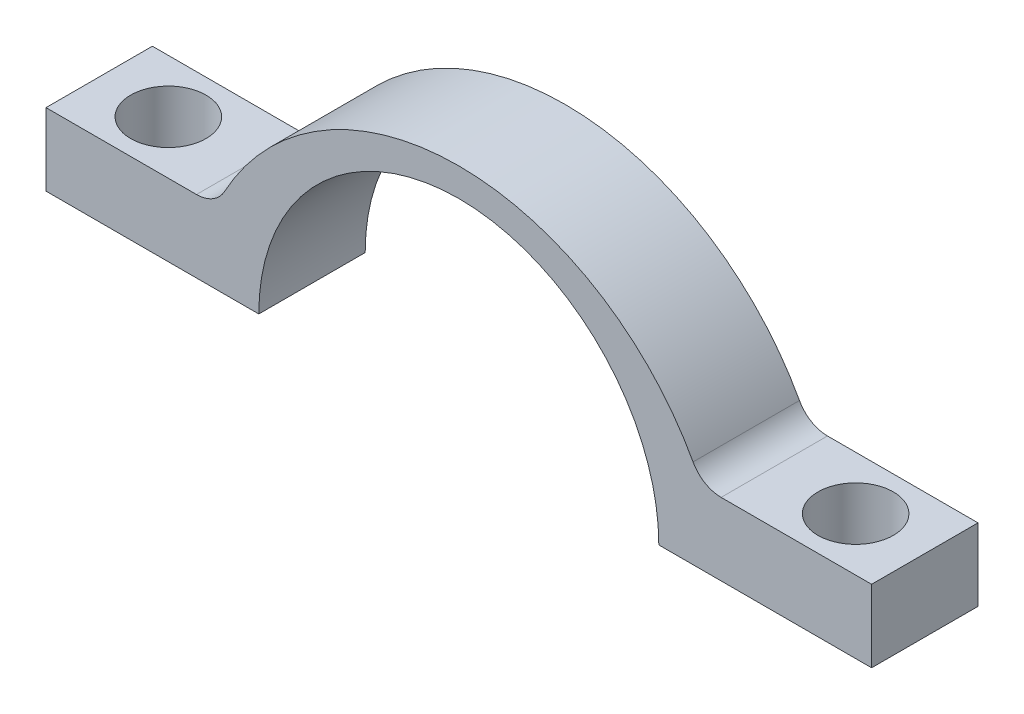
ISO-10303-21;
HEADER;
FILE_DESCRIPTION(('STEP AP214'),'2;1');
FILE_NAME('part.step','',(''),(''),'','','');
FILE_SCHEMA(('AUTOMOTIVE_DESIGN { 1 0 10303 214 1 1 1 1 }'));
ENDSEC;
DATA;
#1=APPLICATION_CONTEXT('core data for automotive mechanical design processes');
#2=APPLICATION_PROTOCOL_DEFINITION('international standard','automotive_design',2000,#1);
#3=PRODUCT_CONTEXT('',#1,'mechanical');
#4=PRODUCT('Part','Part','',(#3));
#5=PRODUCT_RELATED_PRODUCT_CATEGORY('part','',(#4));
#6=PRODUCT_DEFINITION_FORMATION('','',#4);
#7=PRODUCT_DEFINITION_CONTEXT('part definition',#1,'design');
#8=PRODUCT_DEFINITION('design','',#6,#7);
#9=PRODUCT_DEFINITION_SHAPE('','',#8);
#10=(LENGTH_UNIT() NAMED_UNIT(*) SI_UNIT(.MILLI.,.METRE.));
#11=(NAMED_UNIT(*) PLANE_ANGLE_UNIT() SI_UNIT($,.RADIAN.));
#12=(NAMED_UNIT(*) SI_UNIT($,.STERADIAN.) SOLID_ANGLE_UNIT());
#13=UNCERTAINTY_MEASURE_WITH_UNIT(LENGTH_MEASURE(1.E-05),#10,'distance_accuracy_value','');
#14=(GEOMETRIC_REPRESENTATION_CONTEXT(3) GLOBAL_UNCERTAINTY_ASSIGNED_CONTEXT((#13)) GLOBAL_UNIT_ASSIGNED_CONTEXT((#10,
#11,#12)) REPRESENTATION_CONTEXT('',''));
#15=CARTESIAN_POINT('',(0.,0.,0.));
#16=DIRECTION('',(0.,0.,1.));
#17=DIRECTION('',(1.,0.,0.));
#18=AXIS2_PLACEMENT_3D('',#15,#16,#17);
#19=CARTESIAN_POINT('',(-24.638,0.,6.35));
#20=DIRECTION('',(0.,0.,-1.));
#21=DIRECTION('',(-1.,0.,0.));
#22=AXIS2_PLACEMENT_3D('',#19,#20,#21);
#23=CYLINDRICAL_SURFACE('',#22,11.938);
#24=DIRECTION('',(0.,0.,-1.));
#25=VECTOR('',#24,1.);
#26=CARTESIAN_POINT('',(-24.638,11.938,6.35));
#27=LINE('',#26,#25);
#28=CARTESIAN_POINT('',(-24.638,11.938,0.));
#29=VERTEX_POINT('',#28);
#30=CARTESIAN_POINT('',(-24.638,11.938,6.35));
#31=VERTEX_POINT('',#30);
#32=EDGE_CURVE('E11',#29,#31,#27,.F.);
#33=ORIENTED_EDGE('',*,*,#32,.F.);
#34=CARTESIAN_POINT('',(-24.638,0.,0.));
#35=DIRECTION('',(0.,0.,-1.));
#36=DIRECTION('',(-1.,0.,0.));
#37=AXIS2_PLACEMENT_3D('',#34,#35,#36);
#38=CIRCLE('',#37,11.938);
#39=CARTESIAN_POINT('',(-12.7,0.,0.));
#40=VERTEX_POINT('',#39);
#41=EDGE_CURVE('E197',#29,#40,#38,.T.);
#42=ORIENTED_EDGE('',*,*,#41,.T.);
#43=DIRECTION('',(0.,0.,-1.));
#44=VECTOR('',#43,1.);
#45=CARTESIAN_POINT('',(-12.7,0.,6.35));
#46=LINE('',#45,#44);
#47=CARTESIAN_POINT('',(-12.7,0.,6.35));
#48=VERTEX_POINT('',#47);
#49=EDGE_CURVE('E203',#48,#40,#46,.T.);
#50=ORIENTED_EDGE('',*,*,#49,.F.);
#51=CARTESIAN_POINT('',(-24.638,0.,6.35));
#52=DIRECTION('',(0.,0.,-1.));
#53=DIRECTION('',(-1.,0.,0.));
#54=AXIS2_PLACEMENT_3D('',#51,#52,#53);
#55=CIRCLE('',#54,11.938);
#56=EDGE_CURVE('E225',#31,#48,#55,.T.);
#57=ORIENTED_EDGE('',*,*,#56,.F.);
#58=EDGE_LOOP('',(#33,#42,#50,#57));
#59=FACE_BOUND('',#58,.T.);
#60=ADVANCED_FACE('F41',(#59),#23,.F.);
#61=CARTESIAN_POINT('',(0.,0.,6.35));
#62=DIRECTION('',(-1.,0.,0.));
#63=DIRECTION('',(0.,0.,1.));
#64=AXIS2_PLACEMENT_3D('',#61,#62,#63);
#65=PLANE('',#64);
#66=DIRECTION('',(0.,1.,0.));
#67=VECTOR('',#66,1.);
#68=CARTESIAN_POINT('',(0.,0.,0.));
#69=LINE('',#68,#67);
#70=CARTESIAN_POINT('',(0.,0.,0.));
#71=VERTEX_POINT('',#70);
#72=CARTESIAN_POINT('',(0.,4.318,0.));
#73=VERTEX_POINT('',#72);
#74=EDGE_CURVE('E147',#71,#73,#69,.T.);
#75=ORIENTED_EDGE('',*,*,#74,.T.);
#76=DIRECTION('',(0.,0.,-1.));
#77=VECTOR('',#76,1.);
#78=CARTESIAN_POINT('',(0.,4.318,6.35));
#79=LINE('',#78,#77);
#80=CARTESIAN_POINT('',(0.,4.318,6.35));
#81=VERTEX_POINT('',#80);
#82=EDGE_CURVE('E127',#81,#73,#79,.T.);
#83=ORIENTED_EDGE('',*,*,#82,.F.);
#84=DIRECTION('',(0.,1.,0.));
#85=VECTOR('',#84,1.);
#86=CARTESIAN_POINT('',(0.,0.,6.35));
#87=LINE('',#86,#85);
#88=CARTESIAN_POINT('',(0.,0.,6.35));
#89=VERTEX_POINT('',#88);
#90=EDGE_CURVE('E134',#89,#81,#87,.T.);
#91=ORIENTED_EDGE('',*,*,#90,.F.);
#92=DIRECTION('',(0.,0.,-1.));
#93=VECTOR('',#92,1.);
#94=CARTESIAN_POINT('',(0.,0.,6.35));
#95=LINE('',#94,#93);
#96=EDGE_CURVE('E201',#89,#71,#95,.T.);
#97=ORIENTED_EDGE('',*,*,#96,.T.);
#98=EDGE_LOOP('',(#75,#83,#91,#97));
#99=FACE_BOUND('',#98,.T.);
#100=ADVANCED_FACE('F145',(#99),#65,.F.);
#101=CARTESIAN_POINT('',(0.,4.318,6.35));
#102=DIRECTION('',(0.,-1.,0.));
#103=DIRECTION('',(1.,0.,0.));
#104=AXIS2_PLACEMENT_3D('',#101,#102,#103);
#105=PLANE('',#104);
#106=CARTESIAN_POINT('',(-4.12749999999995,4.318,3.17499999999999));
#107=DIRECTION('',(0.,1.,0.));
#108=DIRECTION('',(0.,0.,1.));
#109=AXIS2_PLACEMENT_3D('',#106,#107,#108);
#110=CIRCLE('',#109,2.25);
#111=CARTESIAN_POINT('',(-4.12749999999995,4.318,5.42499999999999));
#112=VERTEX_POINT('',#111);
#113=EDGE_CURVE('E234',#112,#112,#110,.T.);
#114=ORIENTED_EDGE('',*,*,#113,.F.);
#115=EDGE_LOOP('',(#114));
#116=FACE_BOUND('',#115,.T.);
#117=DIRECTION('',(-1.,0.,0.));
#118=VECTOR('',#117,1.);
#119=CARTESIAN_POINT('',(0.,4.318,0.));
#120=LINE('',#119,#118);
#121=CARTESIAN_POINT('',(-8.98296945951191,4.318,0.));
#122=VERTEX_POINT('',#121);
#123=EDGE_CURVE('E183',#73,#122,#120,.T.);
#124=ORIENTED_EDGE('',*,*,#123,.T.);
#125=DIRECTION('',(0.,0.,1.));
#126=VECTOR('',#125,1.);
#127=CARTESIAN_POINT('',(-8.98296945951191,4.318,6.35));
#128=LINE('',#127,#126);
#129=CARTESIAN_POINT('',(-8.98296945951191,4.318,6.35));
#130=VERTEX_POINT('',#129);
#131=EDGE_CURVE('E130',#122,#130,#128,.T.);
#132=ORIENTED_EDGE('',*,*,#131,.T.);
#133=DIRECTION('',(-1.,0.,0.));
#134=VECTOR('',#133,1.);
#135=CARTESIAN_POINT('',(0.,4.318,6.35));
#136=LINE('',#135,#134);
#137=EDGE_CURVE('E122',#81,#130,#136,.T.);
#138=ORIENTED_EDGE('',*,*,#137,.F.);
#139=ORIENTED_EDGE('',*,*,#82,.T.);
#140=EDGE_LOOP('',(#124,#132,#138,#139));
#141=FACE_BOUND('',#140,.T.);
#142=ADVANCED_FACE('F125',(#116,#141),#105,.F.);
#143=CARTESIAN_POINT('',(-24.638,-2.286,6.35));
#144=DIRECTION('',(0.,0.,-1.));
#145=DIRECTION('',(-1.,0.,0.));
#146=AXIS2_PLACEMENT_3D('',#143,#144,#145);
#147=CYLINDRICAL_SURFACE('',#146,15.9130543893999);
#148=CARTESIAN_POINT('',(-24.638,-2.286,0.));
#149=DIRECTION('',(0.,0.,1.));
#150=DIRECTION('',(-1.,0.,0.));
#151=AXIS2_PLACEMENT_3D('',#148,#149,#150);
#152=CIRCLE('',#151,15.9130543893999);
#153=CARTESIAN_POINT('',(-10.6567118630244,5.31326851946062,0.));
#154=VERTEX_POINT('',#153);
#155=CARTESIAN_POINT('',(-38.6192881369756,5.31326851946061,0.));
#156=VERTEX_POINT('',#155);
#157=EDGE_CURVE('E184',#154,#156,#152,.T.);
#158=ORIENTED_EDGE('',*,*,#157,.T.);
#159=DIRECTION('',(0.,0.,-1.));
#160=VECTOR('',#159,1.);
#161=CARTESIAN_POINT('',(-38.6192881369756,5.31326851946062,6.35));
#162=LINE('',#161,#160);
#163=CARTESIAN_POINT('',(-38.6192881369756,5.31326851946061,6.35));
#164=VERTEX_POINT('',#163);
#165=EDGE_CURVE('E161',#156,#164,#162,.F.);
#166=ORIENTED_EDGE('',*,*,#165,.T.);
#167=CARTESIAN_POINT('',(-24.638,-2.286,6.35));
#168=DIRECTION('',(0.,0.,1.));
#169=DIRECTION('',(-1.,0.,0.));
#170=AXIS2_PLACEMENT_3D('',#167,#168,#169);
#171=CIRCLE('',#170,15.9130543893999);
#172=CARTESIAN_POINT('',(-10.6567118630244,5.31326851946062,6.35));
#173=VERTEX_POINT('',#172);
#174=EDGE_CURVE('E133',#173,#164,#171,.T.);
#175=ORIENTED_EDGE('',*,*,#174,.F.);
#176=DIRECTION('',(0.,0.,-1.));
#177=VECTOR('',#176,1.);
#178=CARTESIAN_POINT('',(-10.6567118630244,5.31326851946062,6.35));
#179=LINE('',#178,#177);
#180=EDGE_CURVE('E152',#173,#154,#179,.T.);
#181=ORIENTED_EDGE('',*,*,#180,.T.);
#182=EDGE_LOOP('',(#158,#166,#175,#181));
#183=FACE_BOUND('',#182,.T.);
#184=ADVANCED_FACE('F176',(#183),#147,.T.);
#185=CARTESIAN_POINT('',(-49.276,4.31799999999999,6.35));
#186=DIRECTION('',(0.,-1.,0.));
#187=DIRECTION('',(0.,0.,-1.));
#188=AXIS2_PLACEMENT_3D('',#185,#186,#187);
#189=PLANE('',#188);
#190=CARTESIAN_POINT('',(-45.1485,4.318,3.17499999999999));
#191=DIRECTION('',(0.,1.,0.));
#192=DIRECTION('',(0.,0.,1.));
#193=AXIS2_PLACEMENT_3D('',#190,#191,#192);
#194=CIRCLE('',#193,2.25);
#195=CARTESIAN_POINT('',(-45.1485,4.318,5.425));
#196=VERTEX_POINT('',#195);
#197=EDGE_CURVE('E240',#196,#196,#194,.T.);
#198=ORIENTED_EDGE('',*,*,#197,.F.);
#199=EDGE_LOOP('',(#198));
#200=FACE_BOUND('',#199,.T.);
#201=DIRECTION('',(-1.,0.,0.));
#202=VECTOR('',#201,1.);
#203=CARTESIAN_POINT('',(-49.276,4.31799999999999,6.35));
#204=LINE('',#203,#202);
#205=CARTESIAN_POINT('',(-40.293030540488,4.31799999999999,6.35));
#206=VERTEX_POINT('',#205);
#207=CARTESIAN_POINT('',(-49.276,4.31799999999999,6.35));
#208=VERTEX_POINT('',#207);
#209=EDGE_CURVE('E179',#206,#208,#204,.T.);
#210=ORIENTED_EDGE('',*,*,#209,.F.);
#211=DIRECTION('',(0.,0.,1.));
#212=VECTOR('',#211,1.);
#213=CARTESIAN_POINT('',(-40.293030540488,4.31799999999999,0.));
#214=LINE('',#213,#212);
#215=CARTESIAN_POINT('',(-40.293030540488,4.31799999999999,0.));
#216=VERTEX_POINT('',#215);
#217=EDGE_CURVE('E148',#206,#216,#214,.F.);
#218=ORIENTED_EDGE('',*,*,#217,.T.);
#219=DIRECTION('',(-1.,0.,0.));
#220=VECTOR('',#219,1.);
#221=CARTESIAN_POINT('',(-49.276,4.31799999999999,0.));
#222=LINE('',#221,#220);
#223=CARTESIAN_POINT('',(-49.276,4.31799999999999,0.));
#224=VERTEX_POINT('',#223);
#225=EDGE_CURVE('E186',#216,#224,#222,.T.);
#226=ORIENTED_EDGE('',*,*,#225,.T.);
#227=DIRECTION('',(0.,0.,-1.));
#228=VECTOR('',#227,1.);
#229=CARTESIAN_POINT('',(-49.276,4.31799999999999,6.35));
#230=LINE('',#229,#228);
#231=EDGE_CURVE('E149',#208,#224,#230,.T.);
#232=ORIENTED_EDGE('',*,*,#231,.F.);
#233=EDGE_LOOP('',(#210,#218,#226,#232));
#234=FACE_BOUND('',#233,.T.);
#235=ADVANCED_FACE('F246',(#200,#234),#189,.F.);
#236=CARTESIAN_POINT('',(-49.276,0.,6.35));
#237=DIRECTION('',(1.,0.,0.));
#238=DIRECTION('',(0.,0.,-1.));
#239=AXIS2_PLACEMENT_3D('',#236,#237,#238);
#240=PLANE('',#239);
#241=DIRECTION('',(0.,-1.,0.));
#242=VECTOR('',#241,1.);
#243=CARTESIAN_POINT('',(-49.276,0.,0.));
#244=LINE('',#243,#242);
#245=CARTESIAN_POINT('',(-49.276,0.,0.));
#246=VERTEX_POINT('',#245);
#247=EDGE_CURVE('E193',#224,#246,#244,.T.);
#248=ORIENTED_EDGE('',*,*,#247,.T.);
#249=DIRECTION('',(0.,0.,-1.));
#250=VECTOR('',#249,1.);
#251=CARTESIAN_POINT('',(-49.276,0.,6.35));
#252=LINE('',#251,#250);
#253=CARTESIAN_POINT('',(-49.276,0.,6.35));
#254=VERTEX_POINT('',#253);
#255=EDGE_CURVE('E155',#254,#246,#252,.T.);
#256=ORIENTED_EDGE('',*,*,#255,.F.);
#257=DIRECTION('',(0.,-1.,0.));
#258=VECTOR('',#257,1.);
#259=CARTESIAN_POINT('',(-49.276,0.,6.35));
#260=LINE('',#259,#258);
#261=EDGE_CURVE('E229',#208,#254,#260,.T.);
#262=ORIENTED_EDGE('',*,*,#261,.F.);
#263=ORIENTED_EDGE('',*,*,#231,.T.);
#264=EDGE_LOOP('',(#248,#256,#262,#263));
#265=FACE_BOUND('',#264,.T.);
#266=ADVANCED_FACE('F249',(#265),#240,.F.);
#267=CARTESIAN_POINT('',(-36.576,0.,6.35));
#268=DIRECTION('',(0.,1.,0.));
#269=DIRECTION('',(-1.,0.,0.));
#270=AXIS2_PLACEMENT_3D('',#267,#268,#269);
#271=PLANE('',#270);
#272=CARTESIAN_POINT('',(-45.1485,0.,3.17499999999999));
#273=DIRECTION('',(0.,1.,0.));
#274=DIRECTION('',(0.,0.,1.));
#275=AXIS2_PLACEMENT_3D('',#272,#273,#274);
#276=CIRCLE('',#275,2.25);
#277=CARTESIAN_POINT('',(-45.1485,0.,5.425));
#278=VERTEX_POINT('',#277);
#279=EDGE_CURVE('E237',#278,#278,#276,.T.);
#280=ORIENTED_EDGE('',*,*,#279,.T.);
#281=EDGE_LOOP('',(#280));
#282=FACE_BOUND('',#281,.T.);
#283=DIRECTION('',(1.,0.,0.));
#284=VECTOR('',#283,1.);
#285=CARTESIAN_POINT('',(-36.576,0.,0.));
#286=LINE('',#285,#284);
#287=CARTESIAN_POINT('',(-36.576,0.,0.));
#288=VERTEX_POINT('',#287);
#289=EDGE_CURVE('E195',#246,#288,#286,.T.);
#290=ORIENTED_EDGE('',*,*,#289,.T.);
#291=DIRECTION('',(0.,0.,-1.));
#292=VECTOR('',#291,1.);
#293=CARTESIAN_POINT('',(-36.576,0.,6.35));
#294=LINE('',#293,#292);
#295=CARTESIAN_POINT('',(-36.576,0.,6.35));
#296=VERTEX_POINT('',#295);
#297=EDGE_CURVE('E206',#296,#288,#294,.T.);
#298=ORIENTED_EDGE('',*,*,#297,.F.);
#299=DIRECTION('',(1.,0.,0.));
#300=VECTOR('',#299,1.);
#301=CARTESIAN_POINT('',(-36.576,0.,6.35));
#302=LINE('',#301,#300);
#303=EDGE_CURVE('E215',#254,#296,#302,.T.);
#304=ORIENTED_EDGE('',*,*,#303,.F.);
#305=ORIENTED_EDGE('',*,*,#255,.T.);
#306=EDGE_LOOP('',(#290,#298,#304,#305));
#307=FACE_BOUND('',#306,.T.);
#308=ADVANCED_FACE('F213',(#282,#307),#271,.F.);
#309=EDGE_CURVE('E198',#288,#29,#38,.T.);
#310=ORIENTED_EDGE('',*,*,#309,.T.);
#311=ORIENTED_EDGE('',*,*,#32,.T.);
#312=EDGE_CURVE('E224',#296,#31,#55,.T.);
#313=ORIENTED_EDGE('',*,*,#312,.F.);
#314=ORIENTED_EDGE('',*,*,#297,.T.);
#315=EDGE_LOOP('',(#310,#311,#313,#314));
#316=FACE_BOUND('',#315,.T.);
#317=ADVANCED_FACE('F222',(#316),#23,.F.);
#318=CARTESIAN_POINT('',(0.,0.,6.35));
#319=DIRECTION('',(0.,1.,0.));
#320=DIRECTION('',(-1.,0.,0.));
#321=AXIS2_PLACEMENT_3D('',#318,#319,#320);
#322=PLANE('',#321);
#323=CARTESIAN_POINT('',(-4.12749999999995,0.,3.17499999999999));
#324=DIRECTION('',(0.,1.,0.));
#325=DIRECTION('',(0.,0.,1.));
#326=AXIS2_PLACEMENT_3D('',#323,#324,#325);
#327=CIRCLE('',#326,2.25);
#328=CARTESIAN_POINT('',(-4.12749999999995,0.,5.42499999999999));
#329=VERTEX_POINT('',#328);
#330=EDGE_CURVE('E188',#329,#329,#327,.T.);
#331=ORIENTED_EDGE('',*,*,#330,.T.);
#332=EDGE_LOOP('',(#331));
#333=FACE_BOUND('',#332,.T.);
#334=DIRECTION('',(1.,0.,0.));
#335=VECTOR('',#334,1.);
#336=CARTESIAN_POINT('',(0.,0.,0.));
#337=LINE('',#336,#335);
#338=EDGE_CURVE('E143',#40,#71,#337,.T.);
#339=ORIENTED_EDGE('',*,*,#338,.T.);
#340=ORIENTED_EDGE('',*,*,#96,.F.);
#341=DIRECTION('',(1.,0.,0.));
#342=VECTOR('',#341,1.);
#343=CARTESIAN_POINT('',(0.,0.,6.35));
#344=LINE('',#343,#342);
#345=EDGE_CURVE('E139',#48,#89,#344,.T.);
#346=ORIENTED_EDGE('',*,*,#345,.F.);
#347=ORIENTED_EDGE('',*,*,#49,.T.);
#348=EDGE_LOOP('',(#339,#340,#346,#347));
#349=FACE_BOUND('',#348,.T.);
#350=ADVANCED_FACE('F271',(#333,#349),#322,.F.);
#351=CARTESIAN_POINT('',(-24.638,-2.286,6.35));
#352=DIRECTION('',(0.,0.,-1.));
#353=DIRECTION('',(-1.,0.,0.));
#354=AXIS2_PLACEMENT_3D('',#351,#352,#353);
#355=PLANE('',#354);
#356=ORIENTED_EDGE('',*,*,#90,.T.);
#357=ORIENTED_EDGE('',*,*,#137,.T.);
#358=CARTESIAN_POINT('',(-8.98296945951191,6.223,6.35));
#359=DIRECTION('',(0.,0.,-1.));
#360=DIRECTION('',(-1.,0.,0.));
#361=AXIS2_PLACEMENT_3D('',#358,#359,#360);
#362=CIRCLE('',#361,1.905);
#363=EDGE_CURVE('E50',#130,#173,#362,.T.);
#364=ORIENTED_EDGE('',*,*,#363,.T.);
#365=ORIENTED_EDGE('',*,*,#174,.T.);
#366=CARTESIAN_POINT('',(-40.293030540488,6.22299999999999,6.35));
#367=DIRECTION('',(0.,0.,-1.));
#368=DIRECTION('',(-1.,0.,0.));
#369=AXIS2_PLACEMENT_3D('',#366,#367,#368);
#370=CIRCLE('',#369,1.905);
#371=EDGE_CURVE('E166',#164,#206,#370,.T.);
#372=ORIENTED_EDGE('',*,*,#371,.T.);
#373=ORIENTED_EDGE('',*,*,#209,.T.);
#374=ORIENTED_EDGE('',*,*,#261,.T.);
#375=ORIENTED_EDGE('',*,*,#303,.T.);
#376=ORIENTED_EDGE('',*,*,#312,.T.);
#377=ORIENTED_EDGE('',*,*,#56,.T.);
#378=ORIENTED_EDGE('',*,*,#345,.T.);
#379=EDGE_LOOP('',(#356,#357,#364,#365,#372,#373,#374,#375,#376,#377,#378));
#380=FACE_BOUND('',#379,.T.);
#381=ADVANCED_FACE('F137',(#380),#355,.F.);
#382=CARTESIAN_POINT('',(-24.638,-2.286,0.));
#383=DIRECTION('',(0.,0.,-1.));
#384=DIRECTION('',(-1.,0.,0.));
#385=AXIS2_PLACEMENT_3D('',#382,#383,#384);
#386=PLANE('',#385);
#387=ORIENTED_EDGE('',*,*,#74,.F.);
#388=ORIENTED_EDGE('',*,*,#338,.F.);
#389=ORIENTED_EDGE('',*,*,#41,.F.);
#390=ORIENTED_EDGE('',*,*,#309,.F.);
#391=ORIENTED_EDGE('',*,*,#289,.F.);
#392=ORIENTED_EDGE('',*,*,#247,.F.);
#393=ORIENTED_EDGE('',*,*,#225,.F.);
#394=CARTESIAN_POINT('',(-40.293030540488,6.22299999999999,0.));
#395=DIRECTION('',(0.,0.,-1.));
#396=DIRECTION('',(-1.,0.,0.));
#397=AXIS2_PLACEMENT_3D('',#394,#395,#396);
#398=CIRCLE('',#397,1.905);
#399=EDGE_CURVE('E164',#216,#156,#398,.F.);
#400=ORIENTED_EDGE('',*,*,#399,.T.);
#401=ORIENTED_EDGE('',*,*,#157,.F.);
#402=CARTESIAN_POINT('',(-8.98296945951191,6.223,0.));
#403=DIRECTION('',(0.,0.,-1.));
#404=DIRECTION('',(-1.,0.,0.));
#405=AXIS2_PLACEMENT_3D('',#402,#403,#404);
#406=CIRCLE('',#405,1.905);
#407=EDGE_CURVE('E168',#154,#122,#406,.F.);
#408=ORIENTED_EDGE('',*,*,#407,.T.);
#409=ORIENTED_EDGE('',*,*,#123,.F.);
#410=EDGE_LOOP('',(#387,#388,#389,#390,#391,#392,#393,#400,#401,#408,#409));
#411=FACE_BOUND('',#410,.T.);
#412=ADVANCED_FACE('F182',(#411),#386,.T.);
#413=CARTESIAN_POINT('',(-4.12749999999995,4.318,3.17499999999999));
#414=DIRECTION('',(0.,1.,0.));
#415=DIRECTION('',(0.,0.,1.));
#416=AXIS2_PLACEMENT_3D('',#413,#414,#415);
#417=CYLINDRICAL_SURFACE('',#416,2.25);
#418=ORIENTED_EDGE('',*,*,#330,.F.);
#419=EDGE_LOOP('',(#418));
#420=FACE_BOUND('',#419,.T.);
#421=ORIENTED_EDGE('',*,*,#113,.T.);
#422=EDGE_LOOP('',(#421));
#423=FACE_BOUND('',#422,.T.);
#424=ADVANCED_FACE('F283',(#420,#423),#417,.F.);
#425=CARTESIAN_POINT('',(-40.293030540488,6.22299999999999,6.35));
#426=DIRECTION('',(0.,0.,-1.));
#427=DIRECTION('',(-1.,0.,0.));
#428=AXIS2_PLACEMENT_3D('',#425,#426,#427);
#429=CYLINDRICAL_SURFACE('',#428,1.905);
#430=ORIENTED_EDGE('',*,*,#371,.F.);
#431=ORIENTED_EDGE('',*,*,#165,.F.);
#432=ORIENTED_EDGE('',*,*,#399,.F.);
#433=ORIENTED_EDGE('',*,*,#217,.F.);
#434=EDGE_LOOP('',(#430,#431,#432,#433));
#435=FACE_BOUND('',#434,.T.);
#436=ADVANCED_FACE('F255',(#435),#429,.F.);
#437=CARTESIAN_POINT('',(-8.98296945951191,6.223,6.35));
#438=DIRECTION('',(0.,0.,-1.));
#439=DIRECTION('',(-1.,0.,0.));
#440=AXIS2_PLACEMENT_3D('',#437,#438,#439);
#441=CYLINDRICAL_SURFACE('',#440,1.905);
#442=ORIENTED_EDGE('',*,*,#363,.F.);
#443=ORIENTED_EDGE('',*,*,#131,.F.);
#444=ORIENTED_EDGE('',*,*,#407,.F.);
#445=ORIENTED_EDGE('',*,*,#180,.F.);
#446=EDGE_LOOP('',(#442,#443,#444,#445));
#447=FACE_BOUND('',#446,.T.);
#448=ADVANCED_FACE('F43',(#447),#441,.F.);
#449=CARTESIAN_POINT('',(-45.1485,4.318,3.17499999999999));
#450=DIRECTION('',(0.,1.,0.));
#451=DIRECTION('',(0.,0.,1.));
#452=AXIS2_PLACEMENT_3D('',#449,#450,#451);
#453=CYLINDRICAL_SURFACE('',#452,2.25);
#454=ORIENTED_EDGE('',*,*,#279,.F.);
#455=EDGE_LOOP('',(#454));
#456=FACE_BOUND('',#455,.T.);
#457=ORIENTED_EDGE('',*,*,#197,.T.);
#458=EDGE_LOOP('',(#457));
#459=FACE_BOUND('',#458,.T.);
#460=ADVANCED_FACE('F244',(#456,#459),#453,.F.);
#461=CLOSED_SHELL('',(#60,#100,#142,#184,#235,#266,#308,#317,#350,#381,#412,#424,#436,#448,#460));
#462=MANIFOLD_SOLID_BREP('B2',#461);
#463=ADVANCED_BREP_SHAPE_REPRESENTATION('',(#18,#462),#14);
#464=SHAPE_DEFINITION_REPRESENTATION(#9,#463);
ENDSEC;
END-ISO-10303-21;
